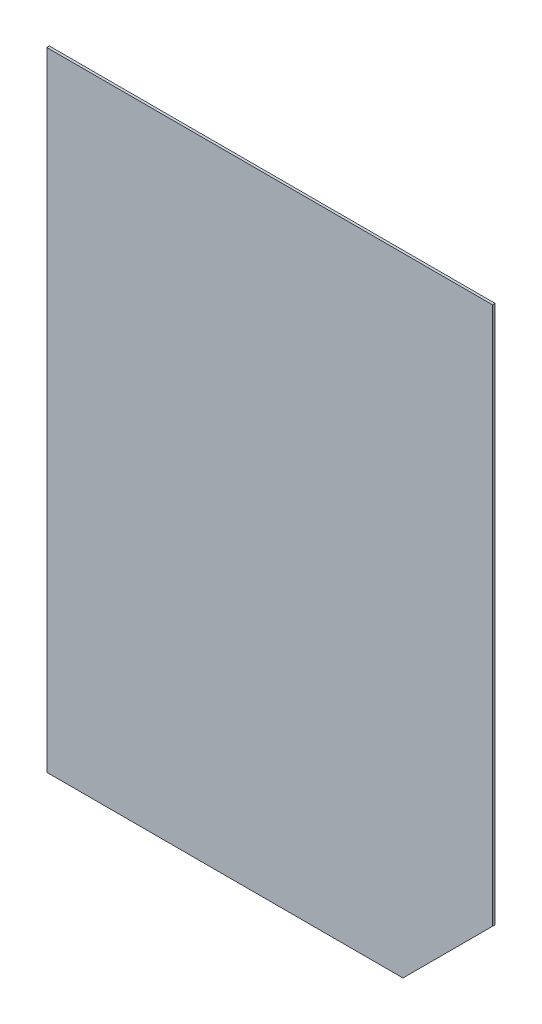
ISO-10303-21;
HEADER;
FILE_DESCRIPTION(('STEP AP214'),'2;1');
FILE_NAME('part.step','',(''),(''),'','','');
FILE_SCHEMA(('AUTOMOTIVE_DESIGN { 1 0 10303 214 1 1 1 1 }'));
ENDSEC;
DATA;
#1=APPLICATION_CONTEXT('core data for automotive mechanical design processes');
#2=APPLICATION_PROTOCOL_DEFINITION('international standard','automotive_design',2000,#1);
#3=PRODUCT_CONTEXT('',#1,'mechanical');
#4=PRODUCT('Part','Part','',(#3));
#5=PRODUCT_RELATED_PRODUCT_CATEGORY('part','',(#4));
#6=PRODUCT_DEFINITION_FORMATION('','',#4);
#7=PRODUCT_DEFINITION_CONTEXT('part definition',#1,'design');
#8=PRODUCT_DEFINITION('design','',#6,#7);
#9=PRODUCT_DEFINITION_SHAPE('','',#8);
#10=(LENGTH_UNIT() NAMED_UNIT(*) SI_UNIT(.MILLI.,.METRE.));
#11=(NAMED_UNIT(*) PLANE_ANGLE_UNIT() SI_UNIT($,.RADIAN.));
#12=(NAMED_UNIT(*) SI_UNIT($,.STERADIAN.) SOLID_ANGLE_UNIT());
#13=UNCERTAINTY_MEASURE_WITH_UNIT(LENGTH_MEASURE(1.E-05),#10,'distance_accuracy_value','');
#14=(GEOMETRIC_REPRESENTATION_CONTEXT(3) GLOBAL_UNCERTAINTY_ASSIGNED_CONTEXT((#13)) GLOBAL_UNIT_ASSIGNED_CONTEXT((#10,
#11,#12)) REPRESENTATION_CONTEXT('',''));
#15=CARTESIAN_POINT('',(0.,0.,0.));
#16=DIRECTION('',(0.,0.,1.));
#17=DIRECTION('',(1.,0.,0.));
#18=AXIS2_PLACEMENT_3D('',#15,#16,#17);
#19=CARTESIAN_POINT('',(10.079814530392,45.822805255858,-1.629325625701));
#20=DIRECTION('',(0.,-8.74227339409097E-08,1.));
#21=DIRECTION('',(-1.,0.,0.));
#22=AXIS2_PLACEMENT_3D('',#19,#20,#21);
#23=PLANE('',#22);
#24=DIRECTION('',(1.19248806384999E-08,1.,8.74227339409097E-08));
#25=VECTOR('',#24,1.);
#26=CARTESIAN_POINT('',(10.079814530392,45.822805255858,-1.629325625701));
#27=LINE('',#26,#25);
#28=CARTESIAN_POINT('',(10.079814530392,45.822805255858,-1.629325625701));
#29=VERTEX_POINT('',#28);
#30=CARTESIAN_POINT('',(10.079814559608,48.272805255858,-1.629325411515));
#31=VERTEX_POINT('',#30);
#32=EDGE_CURVE('E19',#29,#31,#27,.T.);
#33=ORIENTED_EDGE('',*,*,#32,.T.);
#34=DIRECTION('',(1.,-1.19248806385E-08,0.));
#35=VECTOR('',#34,1.);
#36=CARTESIAN_POINT('',(10.079814559608,48.272805255858,-1.629325411515));
#37=LINE('',#36,#35);
#38=CARTESIAN_POINT('',(11.819814559608,48.272805235109,-1.629325411515));
#39=VERTEX_POINT('',#38);
#40=EDGE_CURVE('E82',#31,#39,#37,.T.);
#41=ORIENTED_EDGE('',*,*,#40,.T.);
#42=DIRECTION('',(-1.19248806384999E-08,-1.,-8.74227339409097E-08));
#43=VECTOR('',#42,1.);
#44=CARTESIAN_POINT('',(11.819814559608,48.272805235109,-1.629325411515));
#45=LINE('',#44,#43);
#46=CARTESIAN_POINT('',(11.819814534566,46.172805235109,-1.629325595103));
#47=VERTEX_POINT('',#46);
#48=EDGE_CURVE('E98',#39,#47,#45,.T.);
#49=ORIENTED_EDGE('',*,*,#48,.T.);
#50=DIRECTION('',(-0.707106789619046,-0.707106772754046,-6.1817207262324E-08));
#51=VECTOR('',#50,1.);
#52=CARTESIAN_POINT('',(11.819814534566,46.172805235109,-1.629325595103));
#53=LINE('',#52,#51);
#54=CARTESIAN_POINT('',(11.469814530392,45.822805239283,-1.629325625701));
#55=VERTEX_POINT('',#54);
#56=EDGE_CURVE('E89',#47,#55,#53,.T.);
#57=ORIENTED_EDGE('',*,*,#56,.T.);
#58=DIRECTION('',(-1.,1.19248806385E-08,0.));
#59=VECTOR('',#58,1.);
#60=CARTESIAN_POINT('',(11.469814530392,45.822805239283,-1.629325625701));
#61=LINE('',#60,#59);
#62=EDGE_CURVE('E11',#55,#29,#61,.T.);
#63=ORIENTED_EDGE('',*,*,#62,.T.);
#64=EDGE_LOOP('',(#33,#41,#49,#57,#63));
#65=FACE_BOUND('',#64,.T.);
#66=ADVANCED_FACE('F16',(#65),#23,.F.);
#67=CARTESIAN_POINT('',(10.079814530392,45.822805254984,-1.619325625701));
#68=DIRECTION('',(0.,-8.74227339409097E-08,1.));
#69=DIRECTION('',(-1.,0.,0.));
#70=AXIS2_PLACEMENT_3D('',#67,#68,#69);
#71=PLANE('',#70);
#72=DIRECTION('',(-1.,1.19248806385E-08,0.));
#73=VECTOR('',#72,1.);
#74=CARTESIAN_POINT('',(11.469814530392,45.822805238408,-1.619325625701));
#75=LINE('',#74,#73);
#76=CARTESIAN_POINT('',(11.469814530392,45.822805238408,-1.619325625701));
#77=VERTEX_POINT('',#76);
#78=CARTESIAN_POINT('',(10.079814530392,45.822805254984,-1.619325625701));
#79=VERTEX_POINT('',#78);
#80=EDGE_CURVE('E26',#77,#79,#75,.T.);
#81=ORIENTED_EDGE('',*,*,#80,.F.);
#82=DIRECTION('',(-0.707106789619046,-0.707106772754046,-6.1817207262324E-08));
#83=VECTOR('',#82,1.);
#84=CARTESIAN_POINT('',(11.819814534566,46.172805234235,-1.619325595103));
#85=LINE('',#84,#83);
#86=CARTESIAN_POINT('',(11.819814534566,46.172805234235,-1.619325595103));
#87=VERTEX_POINT('',#86);
#88=EDGE_CURVE('E101',#87,#77,#85,.T.);
#89=ORIENTED_EDGE('',*,*,#88,.F.);
#90=DIRECTION('',(-1.19248806384999E-08,-1.,-8.74227339409097E-08));
#91=VECTOR('',#90,1.);
#92=CARTESIAN_POINT('',(11.819814559608,48.272805234235,-1.619325411515));
#93=LINE('',#92,#91);
#94=CARTESIAN_POINT('',(11.819814559608,48.272805234235,-1.619325411515));
#95=VERTEX_POINT('',#94);
#96=EDGE_CURVE('E62',#95,#87,#93,.T.);
#97=ORIENTED_EDGE('',*,*,#96,.F.);
#98=DIRECTION('',(1.,-1.19248806385E-08,0.));
#99=VECTOR('',#98,1.);
#100=CARTESIAN_POINT('',(10.079814559608,48.272805254984,-1.619325411515));
#101=LINE('',#100,#99);
#102=CARTESIAN_POINT('',(10.079814559608,48.272805254984,-1.619325411515));
#103=VERTEX_POINT('',#102);
#104=EDGE_CURVE('E112',#103,#95,#101,.T.);
#105=ORIENTED_EDGE('',*,*,#104,.F.);
#106=DIRECTION('',(1.19248806384999E-08,1.,8.74227339409097E-08));
#107=VECTOR('',#106,1.);
#108=CARTESIAN_POINT('',(10.079814530392,45.822805254984,-1.619325625701));
#109=LINE('',#108,#107);
#110=EDGE_CURVE('E121',#79,#103,#109,.T.);
#111=ORIENTED_EDGE('',*,*,#110,.F.);
#112=EDGE_LOOP('',(#81,#89,#97,#105,#111));
#113=FACE_BOUND('',#112,.T.);
#114=ADVANCED_FACE('F150',(#113),#71,.T.);
#115=CARTESIAN_POINT('',(11.469814530392,45.822805238408,-1.619325625701));
#116=DIRECTION('',(1.19248806384999E-08,1.,8.74227339409097E-08));
#117=DIRECTION('',(0.990824706895941,0.,-0.135153247110723));
#118=AXIS2_PLACEMENT_3D('',#115,#116,#117);
#119=PLANE('',#118);
#120=ORIENTED_EDGE('',*,*,#80,.T.);
#121=DIRECTION('',(0.,8.74227339409097E-08,-1.));
#122=VECTOR('',#121,1.);
#123=CARTESIAN_POINT('',(10.079814530392,45.822805254984,-1.619325625701));
#124=LINE('',#123,#122);
#125=EDGE_CURVE('E136',#79,#29,#124,.T.);
#126=ORIENTED_EDGE('',*,*,#125,.T.);
#127=ORIENTED_EDGE('',*,*,#62,.F.);
#128=DIRECTION('',(0.,8.74227339409097E-08,-1.));
#129=VECTOR('',#128,1.);
#130=CARTESIAN_POINT('',(11.469814530392,45.822805238408,-1.619325625701));
#131=LINE('',#130,#129);
#132=EDGE_CURVE('E95',#77,#55,#131,.T.);
#133=ORIENTED_EDGE('',*,*,#132,.F.);
#134=EDGE_LOOP('',(#120,#126,#127,#133));
#135=FACE_BOUND('',#134,.T.);
#136=ADVANCED_FACE('F151',(#135),#119,.F.);
#137=CARTESIAN_POINT('',(11.819814534566,46.172805234235,-1.619325595103));
#138=DIRECTION('',(-0.707106772754046,0.707106789619046,6.1817208736654E-08));
#139=DIRECTION('',(8.74227360259718E-08,0.,1.));
#140=AXIS2_PLACEMENT_3D('',#137,#138,#139);
#141=PLANE('',#140);
#142=ORIENTED_EDGE('',*,*,#88,.T.);
#143=ORIENTED_EDGE('',*,*,#132,.T.);
#144=ORIENTED_EDGE('',*,*,#56,.F.);
#145=DIRECTION('',(0.,8.74227339409097E-08,-1.));
#146=VECTOR('',#145,1.);
#147=CARTESIAN_POINT('',(11.819814534566,46.172805234235,-1.619325595103));
#148=LINE('',#147,#146);
#149=EDGE_CURVE('E94',#87,#47,#148,.T.);
#150=ORIENTED_EDGE('',*,*,#149,.F.);
#151=EDGE_LOOP('',(#142,#143,#144,#150));
#152=FACE_BOUND('',#151,.T.);
#153=ADVANCED_FACE('F92',(#152),#141,.F.);
#154=CARTESIAN_POINT('',(11.819814559608,48.272805234235,-1.619325411515));
#155=DIRECTION('',(-1.,1.19248806385E-08,0.));
#156=DIRECTION('',(0.,0.,1.));
#157=AXIS2_PLACEMENT_3D('',#154,#155,#156);
#158=PLANE('',#157);
#159=ORIENTED_EDGE('',*,*,#96,.T.);
#160=ORIENTED_EDGE('',*,*,#149,.T.);
#161=ORIENTED_EDGE('',*,*,#48,.F.);
#162=DIRECTION('',(0.,8.74227339409097E-08,-1.));
#163=VECTOR('',#162,1.);
#164=CARTESIAN_POINT('',(11.819814559608,48.272805234235,-1.619325411515));
#165=LINE('',#164,#163);
#166=EDGE_CURVE('E117',#95,#39,#165,.T.);
#167=ORIENTED_EDGE('',*,*,#166,.F.);
#168=EDGE_LOOP('',(#159,#160,#161,#167));
#169=FACE_BOUND('',#168,.T.);
#170=ADVANCED_FACE('F103',(#169),#158,.F.);
#171=CARTESIAN_POINT('',(10.079814559608,48.272805254984,-1.619325411515));
#172=DIRECTION('',(-1.19248806384999E-08,-1.,-8.74227339409097E-08));
#173=DIRECTION('',(0.,8.74227339409097E-08,-1.));
#174=AXIS2_PLACEMENT_3D('',#171,#172,#173);
#175=PLANE('',#174);
#176=ORIENTED_EDGE('',*,*,#104,.T.);
#177=ORIENTED_EDGE('',*,*,#166,.T.);
#178=ORIENTED_EDGE('',*,*,#40,.F.);
#179=DIRECTION('',(0.,8.74227339409097E-08,-1.));
#180=VECTOR('',#179,1.);
#181=CARTESIAN_POINT('',(10.079814559608,48.272805254984,-1.619325411515));
#182=LINE('',#181,#180);
#183=EDGE_CURVE('E124',#103,#31,#182,.T.);
#184=ORIENTED_EDGE('',*,*,#183,.F.);
#185=EDGE_LOOP('',(#176,#177,#178,#184));
#186=FACE_BOUND('',#185,.T.);
#187=ADVANCED_FACE('F149',(#186),#175,.F.);
#188=CARTESIAN_POINT('',(10.079814530392,45.822805254984,-1.619325625701));
#189=DIRECTION('',(1.,-1.19248806385E-08,0.));
#190=DIRECTION('',(0.,8.74227371082626E-08,-1.));
#191=AXIS2_PLACEMENT_3D('',#188,#189,#190);
#192=PLANE('',#191);
#193=ORIENTED_EDGE('',*,*,#110,.T.);
#194=ORIENTED_EDGE('',*,*,#183,.T.);
#195=ORIENTED_EDGE('',*,*,#32,.F.);
#196=ORIENTED_EDGE('',*,*,#125,.F.);
#197=EDGE_LOOP('',(#193,#194,#195,#196));
#198=FACE_BOUND('',#197,.T.);
#199=ADVANCED_FACE('F206',(#198),#192,.F.);
#200=CLOSED_SHELL('',(#66,#114,#136,#153,#170,#187,#199));
#201=MANIFOLD_SOLID_BREP('B1',#200);
#202=ADVANCED_BREP_SHAPE_REPRESENTATION('',(#18,#201),#14);
#203=SHAPE_DEFINITION_REPRESENTATION(#9,#202);
ENDSEC;
END-ISO-10303-21;
